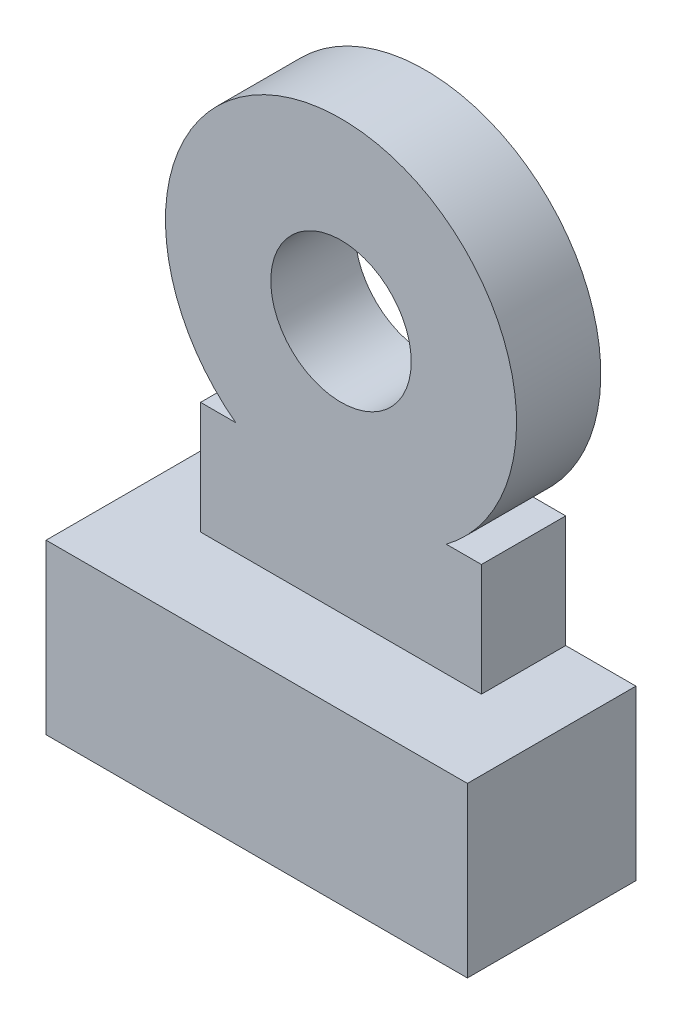
ISO-10303-21;
HEADER;
FILE_DESCRIPTION(('STEP AP214'),'2;1');
FILE_NAME('part.step','',(''),(''),'','','');
FILE_SCHEMA(('AUTOMOTIVE_DESIGN { 1 0 10303 214 1 1 1 1 }'));
ENDSEC;
DATA;
#1=APPLICATION_CONTEXT('core data for automotive mechanical design processes');
#2=APPLICATION_PROTOCOL_DEFINITION('international standard','automotive_design',2000,#1);
#3=PRODUCT_CONTEXT('',#1,'mechanical');
#4=PRODUCT('Part','Part','',(#3));
#5=PRODUCT_RELATED_PRODUCT_CATEGORY('part','',(#4));
#6=PRODUCT_DEFINITION_FORMATION('','',#4);
#7=PRODUCT_DEFINITION_CONTEXT('part definition',#1,'design');
#8=PRODUCT_DEFINITION('design','',#6,#7);
#9=PRODUCT_DEFINITION_SHAPE('','',#8);
#10=(LENGTH_UNIT() NAMED_UNIT(*) SI_UNIT(.MILLI.,.METRE.));
#11=(NAMED_UNIT(*) PLANE_ANGLE_UNIT() SI_UNIT($,.RADIAN.));
#12=(NAMED_UNIT(*) SI_UNIT($,.STERADIAN.) SOLID_ANGLE_UNIT());
#13=UNCERTAINTY_MEASURE_WITH_UNIT(LENGTH_MEASURE(1.E-05),#10,'distance_accuracy_value','');
#14=(GEOMETRIC_REPRESENTATION_CONTEXT(3) GLOBAL_UNCERTAINTY_ASSIGNED_CONTEXT((#13)) GLOBAL_UNIT_ASSIGNED_CONTEXT((#10,
#11,#12)) REPRESENTATION_CONTEXT('',''));
#15=CARTESIAN_POINT('',(0.,0.,0.));
#16=DIRECTION('',(0.,0.,1.));
#17=DIRECTION('',(1.,0.,0.));
#18=AXIS2_PLACEMENT_3D('',#15,#16,#17);
#19=CARTESIAN_POINT('',(0.,6.,-1.2));
#20=DIRECTION('',(0.,0.,1.));
#21=DIRECTION('',(1.,0.,0.));
#22=AXIS2_PLACEMENT_3D('',#19,#20,#21);
#23=CYLINDRICAL_SURFACE('',#22,2.5);
#24=CARTESIAN_POINT('',(0.,6.,0.));
#25=DIRECTION('',(0.,0.,1.));
#26=DIRECTION('',(1.,0.,0.));
#27=AXIS2_PLACEMENT_3D('',#24,#25,#26);
#28=CIRCLE('',#27,2.5);
#29=CARTESIAN_POINT('',(1.5,4.,0.));
#30=VERTEX_POINT('',#29);
#31=CARTESIAN_POINT('',(-1.5,4.,0.));
#32=VERTEX_POINT('',#31);
#33=EDGE_CURVE('E127',#30,#32,#28,.T.);
#34=ORIENTED_EDGE('',*,*,#33,.F.);
#35=DIRECTION('',(0.,0.,1.));
#36=VECTOR('',#35,1.);
#37=CARTESIAN_POINT('',(1.5,4.,-1.2));
#38=LINE('',#37,#36);
#39=CARTESIAN_POINT('',(1.5,4.,-1.2));
#40=VERTEX_POINT('',#39);
#41=EDGE_CURVE('E12',#40,#30,#38,.T.);
#42=ORIENTED_EDGE('',*,*,#41,.F.);
#43=CARTESIAN_POINT('',(0.,6.,-1.2));
#44=DIRECTION('',(0.,0.,1.));
#45=DIRECTION('',(1.,0.,0.));
#46=AXIS2_PLACEMENT_3D('',#43,#44,#45);
#47=CIRCLE('',#46,2.5);
#48=CARTESIAN_POINT('',(-1.5,4.,-1.2));
#49=VERTEX_POINT('',#48);
#50=EDGE_CURVE('E142',#40,#49,#47,.T.);
#51=ORIENTED_EDGE('',*,*,#50,.T.);
#52=DIRECTION('',(0.,0.,1.));
#53=VECTOR('',#52,1.);
#54=CARTESIAN_POINT('',(-1.5,4.,-1.2));
#55=LINE('',#54,#53);
#56=EDGE_CURVE('E45',#49,#32,#55,.T.);
#57=ORIENTED_EDGE('',*,*,#56,.T.);
#58=EDGE_LOOP('',(#34,#42,#51,#57));
#59=FACE_BOUND('',#58,.T.);
#60=ADVANCED_FACE('F42',(#59),#23,.T.);
#61=CARTESIAN_POINT('',(1.5,4.,-1.2));
#62=DIRECTION('',(0.,1.,0.));
#63=DIRECTION('',(0.,0.,1.));
#64=AXIS2_PLACEMENT_3D('',#61,#62,#63);
#65=PLANE('',#64);
#66=DIRECTION('',(-1.,0.,0.));
#67=VECTOR('',#66,1.);
#68=CARTESIAN_POINT('',(1.5,4.,0.));
#69=LINE('',#68,#67);
#70=CARTESIAN_POINT('',(2.,4.,0.));
#71=VERTEX_POINT('',#70);
#72=EDGE_CURVE('E140',#71,#30,#69,.T.);
#73=ORIENTED_EDGE('',*,*,#72,.F.);
#74=DIRECTION('',(0.,0.,1.));
#75=VECTOR('',#74,1.);
#76=CARTESIAN_POINT('',(2.,4.,-1.2));
#77=LINE('',#76,#75);
#78=CARTESIAN_POINT('',(2.,4.,-1.2));
#79=VERTEX_POINT('',#78);
#80=EDGE_CURVE('E51',#79,#71,#77,.T.);
#81=ORIENTED_EDGE('',*,*,#80,.F.);
#82=DIRECTION('',(-1.,0.,0.));
#83=VECTOR('',#82,1.);
#84=CARTESIAN_POINT('',(1.5,4.,-1.2));
#85=LINE('',#84,#83);
#86=EDGE_CURVE('E117',#79,#40,#85,.T.);
#87=ORIENTED_EDGE('',*,*,#86,.T.);
#88=ORIENTED_EDGE('',*,*,#41,.T.);
#89=EDGE_LOOP('',(#73,#81,#87,#88));
#90=FACE_BOUND('',#89,.T.);
#91=ADVANCED_FACE('F150',(#90),#65,.T.);
#92=CARTESIAN_POINT('',(2.,4.,-1.2));
#93=DIRECTION('',(1.,0.,0.));
#94=DIRECTION('',(0.,1.,0.));
#95=AXIS2_PLACEMENT_3D('',#92,#93,#94);
#96=PLANE('',#95);
#97=DIRECTION('',(0.,1.,0.));
#98=VECTOR('',#97,1.);
#99=CARTESIAN_POINT('',(2.,4.,0.));
#100=LINE('',#99,#98);
#101=CARTESIAN_POINT('',(2.,2.4,0.));
#102=VERTEX_POINT('',#101);
#103=EDGE_CURVE('E104',#102,#71,#100,.T.);
#104=ORIENTED_EDGE('',*,*,#103,.F.);
#105=DIRECTION('',(0.,0.,1.));
#106=VECTOR('',#105,1.);
#107=CARTESIAN_POINT('',(2.,2.4,-1.2));
#108=LINE('',#107,#106);
#109=CARTESIAN_POINT('',(2.,2.4,-1.2));
#110=VERTEX_POINT('',#109);
#111=EDGE_CURVE('E99',#110,#102,#108,.T.);
#112=ORIENTED_EDGE('',*,*,#111,.F.);
#113=DIRECTION('',(0.,1.,0.));
#114=VECTOR('',#113,1.);
#115=CARTESIAN_POINT('',(2.,4.,-1.2));
#116=LINE('',#115,#114);
#117=EDGE_CURVE('E102',#110,#79,#116,.T.);
#118=ORIENTED_EDGE('',*,*,#117,.T.);
#119=ORIENTED_EDGE('',*,*,#80,.T.);
#120=EDGE_LOOP('',(#104,#112,#118,#119));
#121=FACE_BOUND('',#120,.T.);
#122=ADVANCED_FACE('F101',(#121),#96,.T.);
#123=CARTESIAN_POINT('',(-2.,2.4,-1.2));
#124=DIRECTION('',(0.,-1.,0.));
#125=DIRECTION('',(0.,0.,-1.));
#126=AXIS2_PLACEMENT_3D('',#123,#124,#125);
#127=PLANE('',#126);
#128=DIRECTION('',(1.,0.,0.));
#129=VECTOR('',#128,1.);
#130=CARTESIAN_POINT('',(-2.,2.4,0.));
#131=LINE('',#130,#129);
#132=CARTESIAN_POINT('',(-2.,2.4,0.));
#133=VERTEX_POINT('',#132);
#134=EDGE_CURVE('E137',#133,#102,#131,.T.);
#135=ORIENTED_EDGE('',*,*,#134,.F.);
#136=DIRECTION('',(0.,0.,1.));
#137=VECTOR('',#136,1.);
#138=CARTESIAN_POINT('',(-2.,2.4,-1.2));
#139=LINE('',#138,#137);
#140=CARTESIAN_POINT('',(-2.,2.4,-1.2));
#141=VERTEX_POINT('',#140);
#142=EDGE_CURVE('E109',#141,#133,#139,.T.);
#143=ORIENTED_EDGE('',*,*,#142,.F.);
#144=DIRECTION('',(1.,0.,0.));
#145=VECTOR('',#144,1.);
#146=CARTESIAN_POINT('',(-2.,2.4,-1.2));
#147=LINE('',#146,#145);
#148=EDGE_CURVE('E115',#141,#110,#147,.T.);
#149=ORIENTED_EDGE('',*,*,#148,.T.);
#150=ORIENTED_EDGE('',*,*,#111,.T.);
#151=EDGE_LOOP('',(#135,#143,#149,#150));
#152=FACE_BOUND('',#151,.T.);
#153=ADVANCED_FACE('F119',(#152),#127,.T.);
#154=CARTESIAN_POINT('',(-2.,4.,-1.2));
#155=DIRECTION('',(-1.,0.,0.));
#156=DIRECTION('',(0.,0.,1.));
#157=AXIS2_PLACEMENT_3D('',#154,#155,#156);
#158=PLANE('',#157);
#159=DIRECTION('',(0.,-1.,0.));
#160=VECTOR('',#159,1.);
#161=CARTESIAN_POINT('',(-2.,4.,0.));
#162=LINE('',#161,#160);
#163=CARTESIAN_POINT('',(-2.,4.,0.));
#164=VERTEX_POINT('',#163);
#165=EDGE_CURVE('E134',#164,#133,#162,.T.);
#166=ORIENTED_EDGE('',*,*,#165,.F.);
#167=DIRECTION('',(0.,0.,1.));
#168=VECTOR('',#167,1.);
#169=CARTESIAN_POINT('',(-2.,4.,-1.2));
#170=LINE('',#169,#168);
#171=CARTESIAN_POINT('',(-2.,4.,-1.2));
#172=VERTEX_POINT('',#171);
#173=EDGE_CURVE('E145',#172,#164,#170,.T.);
#174=ORIENTED_EDGE('',*,*,#173,.F.);
#175=DIRECTION('',(0.,-1.,0.));
#176=VECTOR('',#175,1.);
#177=CARTESIAN_POINT('',(-2.,4.,-1.2));
#178=LINE('',#177,#176);
#179=EDGE_CURVE('E120',#172,#141,#178,.T.);
#180=ORIENTED_EDGE('',*,*,#179,.T.);
#181=ORIENTED_EDGE('',*,*,#142,.T.);
#182=EDGE_LOOP('',(#166,#174,#180,#181));
#183=FACE_BOUND('',#182,.T.);
#184=ADVANCED_FACE('F163',(#183),#158,.T.);
#185=CARTESIAN_POINT('',(-2.,4.,-1.2));
#186=DIRECTION('',(0.,1.,0.));
#187=DIRECTION('',(0.,0.,1.));
#188=AXIS2_PLACEMENT_3D('',#185,#186,#187);
#189=PLANE('',#188);
#190=DIRECTION('',(-1.,0.,0.));
#191=VECTOR('',#190,1.);
#192=CARTESIAN_POINT('',(-2.,4.,0.));
#193=LINE('',#192,#191);
#194=EDGE_CURVE('E130',#32,#164,#193,.T.);
#195=ORIENTED_EDGE('',*,*,#194,.F.);
#196=ORIENTED_EDGE('',*,*,#56,.F.);
#197=DIRECTION('',(-1.,0.,0.));
#198=VECTOR('',#197,1.);
#199=CARTESIAN_POINT('',(-2.,4.,-1.2));
#200=LINE('',#199,#198);
#201=EDGE_CURVE('E122',#49,#172,#200,.T.);
#202=ORIENTED_EDGE('',*,*,#201,.T.);
#203=ORIENTED_EDGE('',*,*,#173,.T.);
#204=EDGE_LOOP('',(#195,#196,#202,#203));
#205=FACE_BOUND('',#204,.T.);
#206=ADVANCED_FACE('F147',(#205),#189,.T.);
#207=CARTESIAN_POINT('',(0.,6.,-1.2));
#208=DIRECTION('',(0.,0.,1.));
#209=DIRECTION('',(1.,0.,0.));
#210=AXIS2_PLACEMENT_3D('',#207,#208,#209);
#211=PLANE('',#210);
#212=CARTESIAN_POINT('',(0.,6.,-1.2));
#213=DIRECTION('',(0.,0.,1.));
#214=DIRECTION('',(1.,0.,0.));
#215=AXIS2_PLACEMENT_3D('',#212,#213,#214);
#216=CIRCLE('',#215,1.);
#217=CARTESIAN_POINT('',(1.,6.,-1.2));
#218=VERTEX_POINT('',#217);
#219=EDGE_CURVE('E131',#218,#218,#216,.T.);
#220=ORIENTED_EDGE('',*,*,#219,.T.);
#221=EDGE_LOOP('',(#220));
#222=FACE_BOUND('',#221,.T.);
#223=ORIENTED_EDGE('',*,*,#50,.F.);
#224=ORIENTED_EDGE('',*,*,#86,.F.);
#225=ORIENTED_EDGE('',*,*,#117,.F.);
#226=ORIENTED_EDGE('',*,*,#148,.F.);
#227=ORIENTED_EDGE('',*,*,#179,.F.);
#228=ORIENTED_EDGE('',*,*,#201,.F.);
#229=EDGE_LOOP('',(#223,#224,#225,#226,#227,#228));
#230=FACE_BOUND('',#229,.T.);
#231=ADVANCED_FACE('F113',(#222,#230),#211,.F.);
#232=CARTESIAN_POINT('',(0.,6.,0.));
#233=DIRECTION('',(0.,0.,1.));
#234=DIRECTION('',(1.,0.,0.));
#235=AXIS2_PLACEMENT_3D('',#232,#233,#234);
#236=PLANE('',#235);
#237=CARTESIAN_POINT('',(0.,6.,0.));
#238=DIRECTION('',(0.,0.,1.));
#239=DIRECTION('',(1.,0.,0.));
#240=AXIS2_PLACEMENT_3D('',#237,#238,#239);
#241=CIRCLE('',#240,1.);
#242=CARTESIAN_POINT('',(1.,6.,0.));
#243=VERTEX_POINT('',#242);
#244=EDGE_CURVE('E186',#243,#243,#241,.T.);
#245=ORIENTED_EDGE('',*,*,#244,.F.);
#246=EDGE_LOOP('',(#245));
#247=FACE_BOUND('',#246,.T.);
#248=ORIENTED_EDGE('',*,*,#33,.T.);
#249=ORIENTED_EDGE('',*,*,#194,.T.);
#250=ORIENTED_EDGE('',*,*,#165,.T.);
#251=ORIENTED_EDGE('',*,*,#134,.T.);
#252=ORIENTED_EDGE('',*,*,#103,.T.);
#253=ORIENTED_EDGE('',*,*,#72,.T.);
#254=EDGE_LOOP('',(#248,#249,#250,#251,#252,#253));
#255=FACE_BOUND('',#254,.T.);
#256=ADVANCED_FACE('F149',(#247,#255),#236,.T.);
#257=CARTESIAN_POINT('',(0.,6.,-1.2));
#258=DIRECTION('',(0.,0.,1.));
#259=DIRECTION('',(1.,0.,0.));
#260=AXIS2_PLACEMENT_3D('',#257,#258,#259);
#261=CYLINDRICAL_SURFACE('',#260,1.);
#262=ORIENTED_EDGE('',*,*,#219,.F.);
#263=EDGE_LOOP('',(#262));
#264=FACE_BOUND('',#263,.T.);
#265=ORIENTED_EDGE('',*,*,#244,.T.);
#266=EDGE_LOOP('',(#265));
#267=FACE_BOUND('',#266,.T.);
#268=ADVANCED_FACE('F174',(#264,#267),#261,.F.);
#269=CLOSED_SHELL('',(#60,#91,#122,#153,#184,#206,#231,#256,#268));
#270=MANIFOLD_SOLID_BREP('B2',#269);
#271=CARTESIAN_POINT('',(3.,2.4,-1.20000000000001));
#272=DIRECTION('',(-1.,0.,0.));
#273=DIRECTION('',(0.,0.,1.));
#274=AXIS2_PLACEMENT_3D('',#271,#272,#273);
#275=PLANE('',#274);
#276=DIRECTION('',(0.,0.,-1.));
#277=VECTOR('',#276,1.);
#278=CARTESIAN_POINT('',(3.,0.,-1.20000000000001));
#279=LINE('',#278,#277);
#280=CARTESIAN_POINT('',(2.99999999999999,0.,1.19999999999999));
#281=VERTEX_POINT('',#280);
#282=CARTESIAN_POINT('',(3.,0.,-1.20000000000001));
#283=VERTEX_POINT('',#282);
#284=EDGE_CURVE('E302',#281,#283,#279,.T.);
#285=ORIENTED_EDGE('',*,*,#284,.T.);
#286=DIRECTION('',(0.,-1.,0.));
#287=VECTOR('',#286,1.);
#288=CARTESIAN_POINT('',(3.,2.4,-1.20000000000001));
#289=LINE('',#288,#287);
#290=CARTESIAN_POINT('',(3.,2.4,-1.20000000000001));
#291=VERTEX_POINT('',#290);
#292=EDGE_CURVE('E40',#291,#283,#289,.T.);
#293=ORIENTED_EDGE('',*,*,#292,.F.);
#294=DIRECTION('',(0.,0.,-1.));
#295=VECTOR('',#294,1.);
#296=CARTESIAN_POINT('',(3.,2.4,-1.20000000000001));
#297=LINE('',#296,#295);
#298=CARTESIAN_POINT('',(2.99999999999999,2.4,1.19999999999999));
#299=VERTEX_POINT('',#298);
#300=EDGE_CURVE('E290',#299,#291,#297,.T.);
#301=ORIENTED_EDGE('',*,*,#300,.F.);
#302=DIRECTION('',(0.,-1.,0.));
#303=VECTOR('',#302,1.);
#304=CARTESIAN_POINT('',(2.99999999999999,2.4,1.19999999999999));
#305=LINE('',#304,#303);
#306=EDGE_CURVE('E298',#299,#281,#305,.T.);
#307=ORIENTED_EDGE('',*,*,#306,.T.);
#308=EDGE_LOOP('',(#285,#293,#301,#307));
#309=FACE_BOUND('',#308,.T.);
#310=ADVANCED_FACE('F239',(#309),#275,.F.);
#311=CARTESIAN_POINT('',(-3.00000000000001,2.4,-1.20000000000001));
#312=DIRECTION('',(0.,0.,1.));
#313=DIRECTION('',(1.,0.,0.));
#314=AXIS2_PLACEMENT_3D('',#311,#312,#313);
#315=PLANE('',#314);
#316=DIRECTION('',(-1.,0.,0.));
#317=VECTOR('',#316,1.);
#318=CARTESIAN_POINT('',(-3.00000000000001,0.,-1.20000000000001));
#319=LINE('',#318,#317);
#320=CARTESIAN_POINT('',(-3.00000000000001,0.,-1.20000000000001));
#321=VERTEX_POINT('',#320);
#322=EDGE_CURVE('E294',#283,#321,#319,.T.);
#323=ORIENTED_EDGE('',*,*,#322,.T.);
#324=DIRECTION('',(0.,-1.,0.));
#325=VECTOR('',#324,1.);
#326=CARTESIAN_POINT('',(-3.00000000000001,2.4,-1.20000000000001));
#327=LINE('',#326,#325);
#328=CARTESIAN_POINT('',(-3.00000000000001,2.4,-1.20000000000001));
#329=VERTEX_POINT('',#328);
#330=EDGE_CURVE('E247',#329,#321,#327,.T.);
#331=ORIENTED_EDGE('',*,*,#330,.F.);
#332=DIRECTION('',(-1.,0.,0.));
#333=VECTOR('',#332,1.);
#334=CARTESIAN_POINT('',(-3.00000000000001,2.4,-1.20000000000001));
#335=LINE('',#334,#333);
#336=EDGE_CURVE('E285',#291,#329,#335,.T.);
#337=ORIENTED_EDGE('',*,*,#336,.F.);
#338=ORIENTED_EDGE('',*,*,#292,.T.);
#339=EDGE_LOOP('',(#323,#331,#337,#338));
#340=FACE_BOUND('',#339,.T.);
#341=ADVANCED_FACE('F293',(#340),#315,.F.);
#342=CARTESIAN_POINT('',(-3.00000000000001,2.4,-1.20000000000001));
#343=DIRECTION('',(1.,0.,0.));
#344=DIRECTION('',(0.,0.,-1.));
#345=AXIS2_PLACEMENT_3D('',#342,#343,#344);
#346=PLANE('',#345);
#347=DIRECTION('',(0.,0.,1.));
#348=VECTOR('',#347,1.);
#349=CARTESIAN_POINT('',(-3.00000000000001,0.,-1.20000000000001));
#350=LINE('',#349,#348);
#351=CARTESIAN_POINT('',(-3.00000000000002,0.,1.19999999999999));
#352=VERTEX_POINT('',#351);
#353=EDGE_CURVE('E272',#321,#352,#350,.T.);
#354=ORIENTED_EDGE('',*,*,#353,.T.);
#355=DIRECTION('',(0.,-1.,0.));
#356=VECTOR('',#355,1.);
#357=CARTESIAN_POINT('',(-3.00000000000002,2.4,1.19999999999999));
#358=LINE('',#357,#356);
#359=CARTESIAN_POINT('',(-3.00000000000002,2.4,1.19999999999999));
#360=VERTEX_POINT('',#359);
#361=EDGE_CURVE('E295',#360,#352,#358,.T.);
#362=ORIENTED_EDGE('',*,*,#361,.F.);
#363=DIRECTION('',(0.,0.,1.));
#364=VECTOR('',#363,1.);
#365=CARTESIAN_POINT('',(-3.00000000000001,2.4,-1.20000000000001));
#366=LINE('',#365,#364);
#367=EDGE_CURVE('E288',#329,#360,#366,.T.);
#368=ORIENTED_EDGE('',*,*,#367,.F.);
#369=ORIENTED_EDGE('',*,*,#330,.T.);
#370=EDGE_LOOP('',(#354,#362,#368,#369));
#371=FACE_BOUND('',#370,.T.);
#372=ADVANCED_FACE('F296',(#371),#346,.F.);
#373=CARTESIAN_POINT('',(-3.00000000000002,2.4,1.19999999999999));
#374=DIRECTION('',(0.,0.,-1.));
#375=DIRECTION('',(-1.,0.,0.));
#376=AXIS2_PLACEMENT_3D('',#373,#374,#375);
#377=PLANE('',#376);
#378=DIRECTION('',(1.,0.,0.));
#379=VECTOR('',#378,1.);
#380=CARTESIAN_POINT('',(-3.00000000000002,0.,1.19999999999999));
#381=LINE('',#380,#379);
#382=EDGE_CURVE('E278',#352,#281,#381,.T.);
#383=ORIENTED_EDGE('',*,*,#382,.T.);
#384=ORIENTED_EDGE('',*,*,#306,.F.);
#385=DIRECTION('',(1.,0.,0.));
#386=VECTOR('',#385,1.);
#387=CARTESIAN_POINT('',(-3.00000000000002,2.4,1.19999999999999));
#388=LINE('',#387,#386);
#389=EDGE_CURVE('E255',#360,#299,#388,.T.);
#390=ORIENTED_EDGE('',*,*,#389,.F.);
#391=ORIENTED_EDGE('',*,*,#361,.T.);
#392=EDGE_LOOP('',(#383,#384,#390,#391));
#393=FACE_BOUND('',#392,.T.);
#394=ADVANCED_FACE('F309',(#393),#377,.F.);
#395=CARTESIAN_POINT('',(2.99999999999999,2.4,1.19999999999999));
#396=DIRECTION('',(0.,1.,0.));
#397=DIRECTION('',(0.,0.,1.));
#398=AXIS2_PLACEMENT_3D('',#395,#396,#397);
#399=PLANE('',#398);
#400=ORIENTED_EDGE('',*,*,#300,.T.);
#401=ORIENTED_EDGE('',*,*,#336,.T.);
#402=ORIENTED_EDGE('',*,*,#367,.T.);
#403=ORIENTED_EDGE('',*,*,#389,.T.);
#404=EDGE_LOOP('',(#400,#401,#402,#403));
#405=FACE_BOUND('',#404,.T.);
#406=ADVANCED_FACE('F286',(#405),#399,.T.);
#407=CARTESIAN_POINT('',(2.99999999999999,0.,1.19999999999999));
#408=DIRECTION('',(0.,1.,0.));
#409=DIRECTION('',(0.,0.,1.));
#410=AXIS2_PLACEMENT_3D('',#407,#408,#409);
#411=PLANE('',#410);
#412=ORIENTED_EDGE('',*,*,#284,.F.);
#413=ORIENTED_EDGE('',*,*,#382,.F.);
#414=ORIENTED_EDGE('',*,*,#353,.F.);
#415=ORIENTED_EDGE('',*,*,#322,.F.);
#416=EDGE_LOOP('',(#412,#413,#414,#415));
#417=FACE_BOUND('',#416,.T.);
#418=ADVANCED_FACE('F312',(#417),#411,.F.);
#419=CLOSED_SHELL('',(#310,#341,#372,#394,#406,#418));
#420=MANIFOLD_SOLID_BREP('B6',#419);
#421=ADVANCED_BREP_SHAPE_REPRESENTATION('',(#18,#270,#420),#14);
#422=SHAPE_DEFINITION_REPRESENTATION(#9,#421);
ENDSEC;
END-ISO-10303-21;
